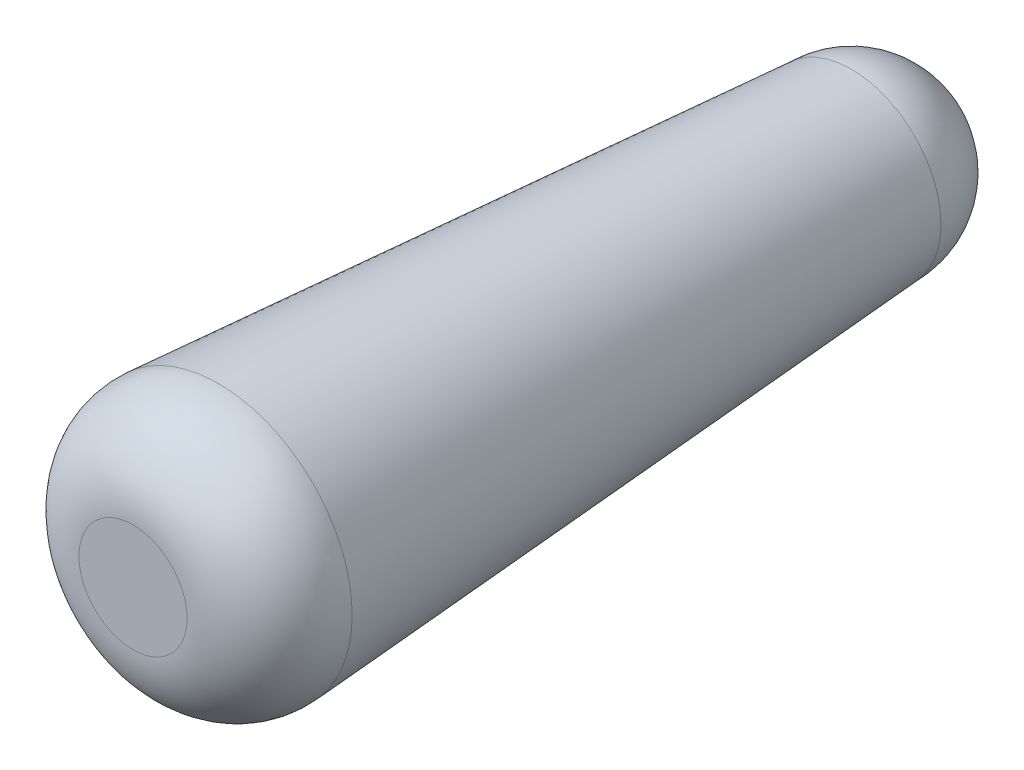
ISO-10303-21;
HEADER;
FILE_DESCRIPTION(('STEP AP214'),'2;1');
FILE_NAME('part.step','',(''),(''),'','','');
FILE_SCHEMA(('AUTOMOTIVE_DESIGN { 1 0 10303 214 1 1 1 1 }'));
ENDSEC;
DATA;
#1=APPLICATION_CONTEXT('core data for automotive mechanical design processes');
#2=APPLICATION_PROTOCOL_DEFINITION('international standard','automotive_design',2000,#1);
#3=PRODUCT_CONTEXT('',#1,'mechanical');
#4=PRODUCT('Part','Part','',(#3));
#5=PRODUCT_RELATED_PRODUCT_CATEGORY('part','',(#4));
#6=PRODUCT_DEFINITION_FORMATION('','',#4);
#7=PRODUCT_DEFINITION_CONTEXT('part definition',#1,'design');
#8=PRODUCT_DEFINITION('design','',#6,#7);
#9=PRODUCT_DEFINITION_SHAPE('','',#8);
#10=(LENGTH_UNIT() NAMED_UNIT(*) SI_UNIT(.MILLI.,.METRE.));
#11=(NAMED_UNIT(*) PLANE_ANGLE_UNIT() SI_UNIT($,.RADIAN.));
#12=(NAMED_UNIT(*) SI_UNIT($,.STERADIAN.) SOLID_ANGLE_UNIT());
#13=UNCERTAINTY_MEASURE_WITH_UNIT(LENGTH_MEASURE(1.E-05),#10,'distance_accuracy_value','');
#14=(GEOMETRIC_REPRESENTATION_CONTEXT(3) GLOBAL_UNCERTAINTY_ASSIGNED_CONTEXT((#13)) GLOBAL_UNIT_ASSIGNED_CONTEXT((#10,
#11,#12)) REPRESENTATION_CONTEXT('',''));
#15=CARTESIAN_POINT('',(0.,0.,0.));
#16=DIRECTION('',(0.,0.,1.));
#17=DIRECTION('',(1.,0.,0.));
#18=AXIS2_PLACEMENT_3D('',#15,#16,#17);
#19=CARTESIAN_POINT('',(0.,0.,0.));
#20=DIRECTION('',(0.,0.,1.));
#21=DIRECTION('',(1.,0.,0.));
#22=AXIS2_PLACEMENT_3D('',#19,#20,#21);
#23=CONICAL_SURFACE('',#22,88.9,0.0698131700797733);
#24=CARTESIAN_POINT('',(0.,0.,-54.3436288662016));
#25=DIRECTION('',(0.,0.,-1.));
#26=DIRECTION('',(-1.,0.,0.));
#27=AXIS2_PLACEMENT_3D('',#24,#25,#26);
#28=CIRCLE('',#27,85.0999232839452);
#29=CARTESIAN_POINT('',(-85.0999232839452,0.,-54.3436288662016));
#30=VERTEX_POINT('',#29);
#31=EDGE_CURVE('E10',#30,#30,#28,.T.);
#32=ORIENTED_EDGE('',*,*,#31,.T.);
#33=EDGE_LOOP('',(#32));
#34=FACE_BOUND('',#33,.T.);
#35=CARTESIAN_POINT('',(0.,0.,-457.2));
#36=DIRECTION('',(0.,0.,1.));
#37=DIRECTION('',(1.,0.,0.));
#38=AXIS2_PLACEMENT_3D('',#35,#36,#37);
#39=CIRCLE('',#38,56.9294615794269);
#40=CARTESIAN_POINT('',(56.9294615794269,0.,-457.2));
#41=VERTEX_POINT('',#40);
#42=EDGE_CURVE('E41',#41,#41,#39,.T.);
#43=ORIENTED_EDGE('',*,*,#42,.T.);
#44=EDGE_LOOP('',(#43));
#45=FACE_BOUND('',#44,.T.);
#46=ADVANCED_FACE('F30',(#34,#45),#23,.T.);
#47=CARTESIAN_POINT('',(0.,0.,0.));
#48=DIRECTION('',(0.,0.,1.));
#49=DIRECTION('',(1.,0.,0.));
#50=AXIS2_PLACEMENT_3D('',#47,#48,#49);
#51=PLANE('',#50);
#52=CARTESIAN_POINT('',(0.,0.,0.));
#53=DIRECTION('',(0.,0.,1.));
#54=DIRECTION('',(1.,0.,0.));
#55=AXIS2_PLACEMENT_3D('',#52,#53,#54);
#56=CIRCLE('',#55,34.4236695307461);
#57=CARTESIAN_POINT('',(34.4236695307461,0.,0.));
#58=VERTEX_POINT('',#57);
#59=EDGE_CURVE('E37',#58,#58,#56,.T.);
#60=ORIENTED_EDGE('',*,*,#59,.T.);
#61=EDGE_LOOP('',(#60));
#62=FACE_BOUND('',#61,.T.);
#63=ADVANCED_FACE('F51',(#62),#51,.T.);
#64=CARTESIAN_POINT('',(0.,0.,-457.2));
#65=DIRECTION('',(0.,-1.,0.));
#66=DIRECTION('',(0.,0.,1.));
#67=AXIS2_PLACEMENT_3D('',#64,#65,#66);
#68=SPHERICAL_SURFACE('',#67,56.9294615794269);
#69=CARTESIAN_POINT('',(0.,0.,-457.2));
#70=DIRECTION('',(0.,0.,1.));
#71=DIRECTION('',(1.,0.,0.));
#72=AXIS2_PLACEMENT_3D('',#69,#70,#71);
#73=SPHERICAL_SURFACE('',#72,56.9294615794269);
#74=ORIENTED_EDGE('',*,*,#42,.F.);
#75=EDGE_LOOP('',(#74));
#76=FACE_BOUND('',#75,.T.);
#77=ADVANCED_FACE('F49',(#76),#73,.T.);
#78=CARTESIAN_POINT('',(0.,0.,-50.8));
#79=DIRECTION('',(0.,0.,1.));
#80=DIRECTION('',(1.,0.,0.));
#81=AXIS2_PLACEMENT_3D('',#78,#79,#80);
#82=DEGENERATE_TOROIDAL_SURFACE('',#81,34.4236695307461,50.8,.T.);
#83=ORIENTED_EDGE('',*,*,#31,.F.);
#84=EDGE_LOOP('',(#83));
#85=FACE_BOUND('',#84,.T.);
#86=ORIENTED_EDGE('',*,*,#59,.F.);
#87=EDGE_LOOP('',(#86));
#88=FACE_BOUND('',#87,.T.);
#89=ADVANCED_FACE('F32',(#85,#88),#82,.T.);
#90=CLOSED_SHELL('',(#46,#63,#77,#89));
#91=MANIFOLD_SOLID_BREP('B2',#90);
#92=ADVANCED_BREP_SHAPE_REPRESENTATION('',(#18,#91),#14);
#93=SHAPE_DEFINITION_REPRESENTATION(#9,#92);
ENDSEC;
END-ISO-10303-21;
